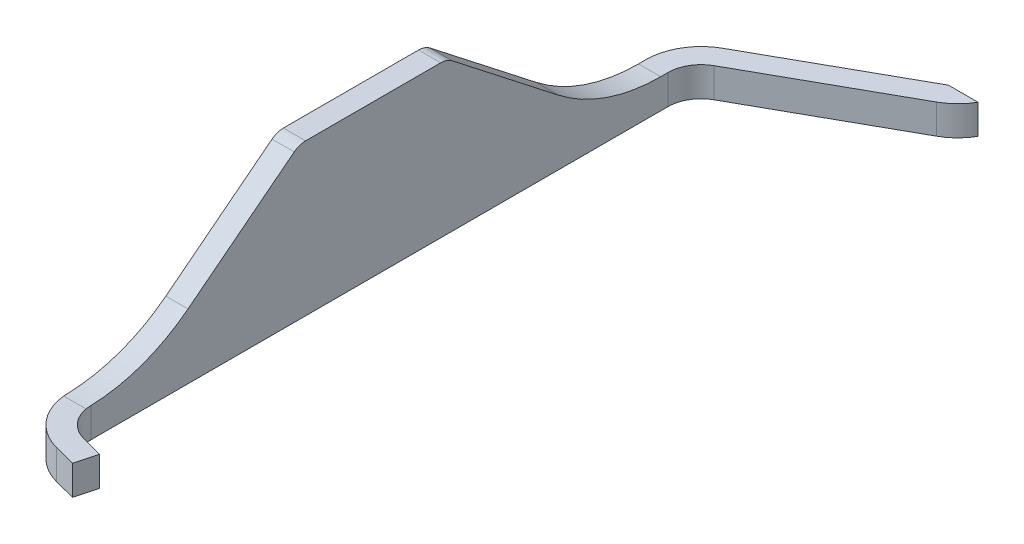
ISO-10303-21;
HEADER;
FILE_DESCRIPTION(('STEP AP214'),'2;1');
FILE_NAME('part.step','',(''),(''),'','','');
FILE_SCHEMA(('AUTOMOTIVE_DESIGN { 1 0 10303 214 1 1 1 1 }'));
ENDSEC;
DATA;
#1=APPLICATION_CONTEXT('core data for automotive mechanical design processes');
#2=APPLICATION_PROTOCOL_DEFINITION('international standard','automotive_design',2000,#1);
#3=PRODUCT_CONTEXT('',#1,'mechanical');
#4=PRODUCT('Part','Part','',(#3));
#5=PRODUCT_RELATED_PRODUCT_CATEGORY('part','',(#4));
#6=PRODUCT_DEFINITION_FORMATION('','',#4);
#7=PRODUCT_DEFINITION_CONTEXT('part definition',#1,'design');
#8=PRODUCT_DEFINITION('design','',#6,#7);
#9=PRODUCT_DEFINITION_SHAPE('','',#8);
#10=(LENGTH_UNIT() NAMED_UNIT(*) SI_UNIT(.MILLI.,.METRE.));
#11=(NAMED_UNIT(*) PLANE_ANGLE_UNIT() SI_UNIT($,.RADIAN.));
#12=(NAMED_UNIT(*) SI_UNIT($,.STERADIAN.) SOLID_ANGLE_UNIT());
#13=UNCERTAINTY_MEASURE_WITH_UNIT(LENGTH_MEASURE(1.E-05),#10,'distance_accuracy_value','');
#14=(GEOMETRIC_REPRESENTATION_CONTEXT(3) GLOBAL_UNCERTAINTY_ASSIGNED_CONTEXT((#13)) GLOBAL_UNIT_ASSIGNED_CONTEXT((#10,
#11,#12)) REPRESENTATION_CONTEXT('',''));
#15=CARTESIAN_POINT('',(0.,0.,0.));
#16=DIRECTION('',(0.,0.,1.));
#17=DIRECTION('',(1.,0.,0.));
#18=AXIS2_PLACEMENT_3D('',#15,#16,#17);
#19=CARTESIAN_POINT('',(-60.,41.,-79.7));
#20=DIRECTION('',(0.,1.,0.));
#21=DIRECTION('',(0.,0.,1.));
#22=AXIS2_PLACEMENT_3D('',#19,#20,#21);
#23=PLANE('',#22);
#24=DIRECTION('',(0.,0.,-1.));
#25=VECTOR('',#24,1.);
#26=CARTESIAN_POINT('',(-75.0000000000001,41.,76.3));
#27=LINE('',#26,#25);
#28=CARTESIAN_POINT('',(-75.0000000000001,41.,18.2797477350336));
#29=VERTEX_POINT('',#28);
#30=CARTESIAN_POINT('',(-75.0000000000001,40.9999999999988,-18.2797477350337));
#31=VERTEX_POINT('',#30);
#32=EDGE_CURVE('E356',#29,#31,#27,.T.);
#33=ORIENTED_EDGE('',*,*,#32,.F.);
#34=DIRECTION('',(-1.,0.,0.));
#35=VECTOR('',#34,1.);
#36=CARTESIAN_POINT('',(-20.1050949517347,41.,18.2797477350336));
#37=LINE('',#36,#35);
#38=CARTESIAN_POINT('',(-69.,41.,18.2797477350336));
#39=VERTEX_POINT('',#38);
#40=EDGE_CURVE('E227',#39,#29,#37,.T.);
#41=ORIENTED_EDGE('',*,*,#40,.F.);
#42=DIRECTION('',(0.,0.,1.));
#43=VECTOR('',#42,1.);
#44=CARTESIAN_POINT('',(-69.,41.,76.3));
#45=LINE('',#44,#43);
#46=CARTESIAN_POINT('',(-69.,41.,-18.2797477350337));
#47=VERTEX_POINT('',#46);
#48=EDGE_CURVE('E359',#47,#39,#45,.T.);
#49=ORIENTED_EDGE('',*,*,#48,.F.);
#50=DIRECTION('',(-1.,0.,0.));
#51=VECTOR('',#50,1.);
#52=CARTESIAN_POINT('',(-20.1050949517347,40.9999999999994,-18.2797477350336));
#53=LINE('',#52,#51);
#54=EDGE_CURVE('E220',#47,#31,#53,.T.);
#55=ORIENTED_EDGE('',*,*,#54,.T.);
#56=EDGE_LOOP('',(#33,#41,#49,#55));
#57=FACE_BOUND('',#56,.T.);
#58=ADVANCED_FACE('F35',(#57),#23,.T.);
#59=CARTESIAN_POINT('',(-20.1060949517347,41.,-114.7));
#60=DIRECTION('',(0.,0.,1.));
#61=DIRECTION('',(-1.,0.,0.));
#62=AXIS2_PLACEMENT_3D('',#59,#60,#61);
#63=PLANE('',#62);
#64=DIRECTION('',(0.,-1.,0.));
#65=VECTOR('',#64,1.);
#66=CARTESIAN_POINT('',(-20.1060949517347,41.,-114.7));
#67=LINE('',#66,#65);
#68=CARTESIAN_POINT('',(-20.1060949517347,8.00000000000119,-114.7));
#69=VERTEX_POINT('',#68);
#70=CARTESIAN_POINT('',(-20.1060949517347,0.,-114.7));
#71=VERTEX_POINT('',#70);
#72=EDGE_CURVE('E11',#69,#71,#67,.T.);
#73=ORIENTED_EDGE('',*,*,#72,.T.);
#74=DIRECTION('',(1.,0.,0.));
#75=VECTOR('',#74,1.);
#76=CARTESIAN_POINT('',(-20.1060949517347,0.,-114.7));
#77=LINE('',#76,#75);
#78=CARTESIAN_POINT('',(-28.1060949517348,0.,-114.7));
#79=VERTEX_POINT('',#78);
#80=EDGE_CURVE('E391',#79,#71,#77,.T.);
#81=ORIENTED_EDGE('',*,*,#80,.F.);
#82=DIRECTION('',(0.,-1.,0.));
#83=VECTOR('',#82,1.);
#84=CARTESIAN_POINT('',(-28.1060949517348,41.,-114.7));
#85=LINE('',#84,#83);
#86=CARTESIAN_POINT('',(-28.1060949517348,8.00000000000053,-114.7));
#87=VERTEX_POINT('',#86);
#88=EDGE_CURVE('E353',#87,#79,#85,.T.);
#89=ORIENTED_EDGE('',*,*,#88,.F.);
#90=DIRECTION('',(-1.,0.,0.));
#91=VECTOR('',#90,1.);
#92=CARTESIAN_POINT('',(-20.1050949517347,8.00000000000074,-114.7));
#93=LINE('',#92,#91);
#94=EDGE_CURVE('E193',#69,#87,#93,.T.);
#95=ORIENTED_EDGE('',*,*,#94,.F.);
#96=EDGE_LOOP('',(#73,#81,#89,#95));
#97=FACE_BOUND('',#96,.T.);
#98=ADVANCED_FACE('F37',(#97),#63,.F.);
#99=CARTESIAN_POINT('',(-33.0782482086875,41.,-122.231483245558));
#100=DIRECTION('',(0.,-1.,0.));
#101=DIRECTION('',(0.,0.,-1.));
#102=AXIS2_PLACEMENT_3D('',#99,#100,#101);
#103=CYLINDRICAL_SURFACE('',#102,15.);
#104=DIRECTION('',(0.,-1.,0.));
#105=VECTOR('',#104,1.);
#106=CARTESIAN_POINT('',(-25.7625331487724,41.,-109.136434060384));
#107=LINE('',#106,#105);
#108=CARTESIAN_POINT('',(-25.7625331487724,8.00000000000042,-109.136434060384));
#109=VERTEX_POINT('',#108);
#110=CARTESIAN_POINT('',(-25.7625331487724,0.,-109.136434060384));
#111=VERTEX_POINT('',#110);
#112=EDGE_CURVE('E43',#109,#111,#107,.T.);
#113=ORIENTED_EDGE('',*,*,#112,.T.);
#114=CARTESIAN_POINT('',(-33.0782482086875,0.,-122.231483245558));
#115=DIRECTION('',(0.,-1.,0.));
#116=DIRECTION('',(0.,0.,-1.));
#117=AXIS2_PLACEMENT_3D('',#114,#115,#116);
#118=CIRCLE('',#117,15.);
#119=EDGE_CURVE('E320',#71,#111,#118,.T.);
#120=ORIENTED_EDGE('',*,*,#119,.F.);
#121=ORIENTED_EDGE('',*,*,#72,.F.);
#122=CARTESIAN_POINT('',(-33.0782482086875,8.0000000000009,-122.231483245558));
#123=DIRECTION('',(0.,1.,0.));
#124=DIRECTION('',(0.,0.,-1.));
#125=AXIS2_PLACEMENT_3D('',#122,#123,#124);
#126=CIRCLE('',#125,15.);
#127=EDGE_CURVE('E226',#69,#109,#126,.F.);
#128=ORIENTED_EDGE('',*,*,#127,.T.);
#129=EDGE_LOOP('',(#113,#120,#121,#128));
#130=FACE_BOUND('',#129,.T.);
#131=ADVANCED_FACE('F307',(#130),#103,.T.);
#132=CARTESIAN_POINT('',(-64.3894290359491,41.,-87.5570295111045));
#133=DIRECTION('',(-0.487714337327672,0.,-0.873003279011614));
#134=DIRECTION('',(0.873003279011614,0.,-0.487714337327672));
#135=AXIS2_PLACEMENT_3D('',#132,#133,#134);
#136=PLANE('',#135);
#137=DIRECTION('',(0.,-1.,0.));
#138=VECTOR('',#137,1.);
#139=CARTESIAN_POINT('',(-64.3894290359491,41.,-87.5570295111045));
#140=LINE('',#139,#138);
#141=CARTESIAN_POINT('',(-64.3894290359491,8.00000000000023,-87.5570295111045));
#142=VERTEX_POINT('',#141);
#143=CARTESIAN_POINT('',(-64.3894290359491,0.,-87.5570295111045));
#144=VERTEX_POINT('',#143);
#145=EDGE_CURVE('E323',#142,#144,#140,.T.);
#146=ORIENTED_EDGE('',*,*,#145,.T.);
#147=DIRECTION('',(-0.873003279011614,0.,0.487714337327672));
#148=VECTOR('',#147,1.);
#149=CARTESIAN_POINT('',(-64.3894290359491,0.,-87.5570295111045));
#150=LINE('',#149,#148);
#151=EDGE_CURVE('E387',#111,#144,#150,.T.);
#152=ORIENTED_EDGE('',*,*,#151,.F.);
#153=ORIENTED_EDGE('',*,*,#112,.F.);
#154=DIRECTION('',(-0.873003279011614,0.,0.487714337327672));
#155=VECTOR('',#154,1.);
#156=CARTESIAN_POINT('',(-19.0819689917233,8.00000000000071,-112.86861582781));
#157=LINE('',#156,#155);
#158=EDGE_CURVE('E439',#109,#142,#157,.T.);
#159=ORIENTED_EDGE('',*,*,#158,.T.);
#160=EDGE_LOOP('',(#146,#152,#153,#159));
#161=FACE_BOUND('',#160,.T.);
#162=ADVANCED_FACE('F304',(#161),#136,.F.);
#163=CARTESIAN_POINT('',(-60.,41.,-79.7));
#164=DIRECTION('',(0.,-1.,0.));
#165=DIRECTION('',(0.,0.,-1.));
#166=AXIS2_PLACEMENT_3D('',#163,#164,#165);
#167=CYLINDRICAL_SURFACE('',#166,9.00000000000002);
#168=DIRECTION('',(0.,-1.,0.));
#169=VECTOR('',#168,1.);
#170=CARTESIAN_POINT('',(-69.,41.,-79.7));
#171=LINE('',#170,#169);
#172=CARTESIAN_POINT('',(-69.,8.00000000000003,-79.7));
#173=VERTEX_POINT('',#172);
#174=CARTESIAN_POINT('',(-69.,0.,-79.7));
#175=VERTEX_POINT('',#174);
#176=EDGE_CURVE('E325',#173,#175,#171,.T.);
#177=ORIENTED_EDGE('',*,*,#176,.T.);
#178=CARTESIAN_POINT('',(-60.,0.,-79.7));
#179=DIRECTION('',(0.,1.,0.));
#180=DIRECTION('',(0.,0.,1.));
#181=AXIS2_PLACEMENT_3D('',#178,#179,#180);
#182=CIRCLE('',#181,9.00000000000002);
#183=EDGE_CURVE('E384',#144,#175,#182,.T.);
#184=ORIENTED_EDGE('',*,*,#183,.F.);
#185=ORIENTED_EDGE('',*,*,#145,.F.);
#186=CARTESIAN_POINT('',(-60.,8.00000000000005,-79.7));
#187=DIRECTION('',(0.,1.,0.));
#188=DIRECTION('',(0.,0.,-1.));
#189=AXIS2_PLACEMENT_3D('',#186,#187,#188);
#190=CIRCLE('',#189,9.00000000000002);
#191=EDGE_CURVE('E223',#142,#173,#190,.T.);
#192=ORIENTED_EDGE('',*,*,#191,.T.);
#193=EDGE_LOOP('',(#177,#184,#185,#192));
#194=FACE_BOUND('',#193,.T.);
#195=ADVANCED_FACE('F301',(#194),#167,.F.);
#196=CARTESIAN_POINT('',(-69.,41.,76.3));
#197=DIRECTION('',(-1.,0.,0.));
#198=DIRECTION('',(0.,0.,-1.));
#199=AXIS2_PLACEMENT_3D('',#196,#197,#198);
#200=PLANE('',#199);
#201=CARTESIAN_POINT('',(-69.,53.,-77.7635203846935));
#202=DIRECTION('',(1.,0.,0.));
#203=DIRECTION('',(0.,0.,-1.));
#204=AXIS2_PLACEMENT_3D('',#201,#202,#203);
#205=CIRCLE('',#204,45.);
#206=CARTESIAN_POINT('',(-69.,8.00000000000001,-77.7635203846937));
#207=VERTEX_POINT('',#206);
#208=CARTESIAN_POINT('',(-69.,17.5257897431719,-50.0763318915591));
#209=VERTEX_POINT('',#208);
#210=EDGE_CURVE('E189',#207,#209,#205,.F.);
#211=ORIENTED_EDGE('',*,*,#210,.T.);
#212=DIRECTION('',(0.,0.615270855402983,0.788315783485071));
#213=VECTOR('',#212,1.);
#214=CARTESIAN_POINT('',(-69.,39.9415789174242,-21.3561020120485));
#215=LINE('',#214,#213);
#216=CARTESIAN_POINT('',(-69.,39.9415789174242,-21.3561020120485));
#217=VERTEX_POINT('',#216);
#218=EDGE_CURVE('E217',#209,#217,#215,.T.);
#219=ORIENTED_EDGE('',*,*,#218,.T.);
#220=CARTESIAN_POINT('',(-69.,35.9999999999988,-18.2797477350336));
#221=DIRECTION('',(1.,0.,0.));
#222=DIRECTION('',(0.,0.,-1.));
#223=AXIS2_PLACEMENT_3D('',#220,#221,#222);
#224=CIRCLE('',#223,5.);
#225=EDGE_CURVE('E50',#217,#47,#224,.T.);
#226=ORIENTED_EDGE('',*,*,#225,.T.);
#227=ORIENTED_EDGE('',*,*,#48,.T.);
#228=CARTESIAN_POINT('',(-69.,36.,18.2797477350336));
#229=DIRECTION('',(1.,0.,0.));
#230=DIRECTION('',(0.,0.,-1.));
#231=AXIS2_PLACEMENT_3D('',#228,#229,#230);
#232=CIRCLE('',#231,5.);
#233=CARTESIAN_POINT('',(-69.,39.9415789174253,21.3561020120485));
#234=VERTEX_POINT('',#233);
#235=EDGE_CURVE('E422',#39,#234,#232,.T.);
#236=ORIENTED_EDGE('',*,*,#235,.T.);
#237=DIRECTION('',(0.,-0.615270855402983,0.788315783485071));
#238=VECTOR('',#237,1.);
#239=CARTESIAN_POINT('',(-69.,39.9415789174253,21.3561020120485));
#240=LINE('',#239,#238);
#241=CARTESIAN_POINT('',(-69.,17.5257897431719,50.0763318915607));
#242=VERTEX_POINT('',#241);
#243=EDGE_CURVE('E424',#234,#242,#240,.T.);
#244=ORIENTED_EDGE('',*,*,#243,.T.);
#245=CARTESIAN_POINT('',(-69.,53.,77.763520384695));
#246=DIRECTION('',(1.,0.,0.));
#247=DIRECTION('',(0.,0.,-1.));
#248=AXIS2_PLACEMENT_3D('',#245,#246,#247);
#249=CIRCLE('',#248,45.);
#250=CARTESIAN_POINT('',(-69.,8.02380509554436,76.3));
#251=VERTEX_POINT('',#250);
#252=EDGE_CURVE('E393',#242,#251,#249,.F.);
#253=ORIENTED_EDGE('',*,*,#252,.T.);
#254=DIRECTION('',(0.,-1.,0.));
#255=VECTOR('',#254,1.);
#256=CARTESIAN_POINT('',(-69.,41.,76.3));
#257=LINE('',#256,#255);
#258=CARTESIAN_POINT('',(-69.,0.,76.3));
#259=VERTEX_POINT('',#258);
#260=EDGE_CURVE('E330',#251,#259,#257,.T.);
#261=ORIENTED_EDGE('',*,*,#260,.T.);
#262=DIRECTION('',(0.,0.,1.));
#263=VECTOR('',#262,1.);
#264=CARTESIAN_POINT('',(-69.,0.,76.3));
#265=LINE('',#264,#263);
#266=EDGE_CURVE('E381',#175,#259,#265,.T.);
#267=ORIENTED_EDGE('',*,*,#266,.F.);
#268=ORIENTED_EDGE('',*,*,#176,.F.);
#269=DIRECTION('',(0.,0.,1.));
#270=VECTOR('',#269,1.);
#271=CARTESIAN_POINT('',(-69.,8.00000000000074,-114.7));
#272=LINE('',#271,#270);
#273=EDGE_CURVE('E209',#173,#207,#272,.T.);
#274=ORIENTED_EDGE('',*,*,#273,.T.);
#275=EDGE_LOOP('',(#211,#219,#226,#227,#236,#244,#253,#261,#267,#268,#274));
#276=FACE_BOUND('',#275,.T.);
#277=ADVANCED_FACE('F297',(#276),#200,.F.);
#278=CARTESIAN_POINT('',(-60.,41.,76.3));
#279=DIRECTION('',(0.,-1.,0.));
#280=DIRECTION('',(0.,0.,-1.));
#281=AXIS2_PLACEMENT_3D('',#278,#279,#280);
#282=CYLINDRICAL_SURFACE('',#281,9.00000000000001);
#283=DIRECTION('',(0.,-1.,0.));
#284=VECTOR('',#283,1.);
#285=CARTESIAN_POINT('',(-62.2692463644368,41.,85.0092204552125));
#286=LINE('',#285,#284);
#287=CARTESIAN_POINT('',(-62.2692463644368,8.,85.0092204552125));
#288=VERTEX_POINT('',#287);
#289=CARTESIAN_POINT('',(-62.2692463644368,0.,85.0092204552125));
#290=VERTEX_POINT('',#289);
#291=EDGE_CURVE('E333',#288,#290,#286,.T.);
#292=ORIENTED_EDGE('',*,*,#291,.T.);
#293=CARTESIAN_POINT('',(-60.,0.,76.3));
#294=DIRECTION('',(0.,1.,0.));
#295=DIRECTION('',(0.,0.,1.));
#296=AXIS2_PLACEMENT_3D('',#293,#294,#295);
#297=CIRCLE('',#296,9.00000000000001);
#298=EDGE_CURVE('E378',#259,#290,#297,.T.);
#299=ORIENTED_EDGE('',*,*,#298,.F.);
#300=ORIENTED_EDGE('',*,*,#260,.F.);
#301=CARTESIAN_POINT('',(-69.,8.02380509554436,76.3));
#302=CARTESIAN_POINT('',(-68.9999719529658,8.01584383382791,76.5454869876502));
#303=CARTESIAN_POINT('',(-68.9899753282851,8.00987944500765,76.7901905135326));
#304=CARTESIAN_POINT('',(-68.9500449236305,8.0019444131595,77.2780306417643));
#305=CARTESIAN_POINT('',(-68.9201111436563,7.99997377013163,77.5211672441136));
#306=CARTESIAN_POINT('',(-68.8802087860355,8.00000000000001,77.7635203846952));
#307=B_SPLINE_CURVE_WITH_KNOTS('',3,(#301,#302,#303,#304,#305,#306),.UNSPECIFIED.,.F.,.F.,(4,2,
4),(0.,0.734940744662144,1.46988148933146),.UNSPECIFIED.);
#308=CARTESIAN_POINT('',(-68.8802087860355,8.00000000000001,77.7635203846952));
#309=VERTEX_POINT('',#308);
#310=EDGE_CURVE('E240',#251,#309,#307,.T.);
#311=ORIENTED_EDGE('',*,*,#310,.T.);
#312=CARTESIAN_POINT('',(-60.,8.00000000000001,76.3));
#313=DIRECTION('',(0.,1.,0.));
#314=DIRECTION('',(0.,0.,-1.));
#315=AXIS2_PLACEMENT_3D('',#312,#313,#314);
#316=CIRCLE('',#315,9.00000000000001);
#317=EDGE_CURVE('E398',#309,#288,#316,.T.);
#318=ORIENTED_EDGE('',*,*,#317,.T.);
#319=EDGE_LOOP('',(#292,#299,#300,#311,#318));
#320=FACE_BOUND('',#319,.T.);
#321=ADVANCED_FACE('F293',(#320),#282,.F.);
#322=CARTESIAN_POINT('',(-56.4630993942952,41.,86.522051364837));
#323=DIRECTION('',(-0.25213848493742,0.,0.967691161690269));
#324=DIRECTION('',(-0.967691161690269,0.,-0.25213848493742));
#325=AXIS2_PLACEMENT_3D('',#322,#323,#324);
#326=PLANE('',#325);
#327=DIRECTION('',(0.,-1.,0.));
#328=VECTOR('',#327,1.);
#329=CARTESIAN_POINT('',(-56.4630993942952,41.,86.522051364837));
#330=LINE('',#329,#328);
#331=CARTESIAN_POINT('',(-56.4630993942952,8.,86.522051364837));
#332=VERTEX_POINT('',#331);
#333=CARTESIAN_POINT('',(-56.4630993942952,0.,86.522051364837));
#334=VERTEX_POINT('',#333);
#335=EDGE_CURVE('E336',#332,#334,#330,.T.);
#336=ORIENTED_EDGE('',*,*,#335,.T.);
#337=DIRECTION('',(0.967691161690269,0.,0.25213848493742));
#338=VECTOR('',#337,1.);
#339=CARTESIAN_POINT('',(-56.4630993942952,0.,86.522051364837));
#340=LINE('',#339,#338);
#341=EDGE_CURVE('E375',#290,#334,#340,.T.);
#342=ORIENTED_EDGE('',*,*,#341,.F.);
#343=ORIENTED_EDGE('',*,*,#291,.F.);
#344=DIRECTION('',(0.967691161690269,0.,0.25213848493742));
#345=VECTOR('',#344,1.);
#346=CARTESIAN_POINT('',(-20.9998575448981,8.,95.7622391694439));
#347=LINE('',#346,#345);
#348=EDGE_CURVE('E401',#288,#332,#347,.T.);
#349=ORIENTED_EDGE('',*,*,#348,.T.);
#350=EDGE_LOOP('',(#336,#342,#343,#349));
#351=FACE_BOUND('',#350,.T.);
#352=ADVANCED_FACE('F289',(#351),#326,.F.);
#353=CARTESIAN_POINT('',(-57.9759303039197,41.,92.3281983349786));
#354=DIRECTION('',(-0.96769116169027,0.,-0.252138484937418));
#355=DIRECTION('',(0.252138484937418,0.,-0.96769116169027));
#356=AXIS2_PLACEMENT_3D('',#353,#354,#355);
#357=PLANE('',#356);
#358=DIRECTION('',(0.,-1.,0.));
#359=VECTOR('',#358,1.);
#360=CARTESIAN_POINT('',(-57.9759303039197,41.,92.3281983349786));
#361=LINE('',#360,#359);
#362=CARTESIAN_POINT('',(-57.9759303039197,8.,92.3281983349786));
#363=VERTEX_POINT('',#362);
#364=CARTESIAN_POINT('',(-57.9759303039197,0.,92.3281983349786));
#365=VERTEX_POINT('',#364);
#366=EDGE_CURVE('E339',#363,#365,#361,.T.);
#367=ORIENTED_EDGE('',*,*,#366,.T.);
#368=DIRECTION('',(-0.252138484937418,0.,0.96769116169027));
#369=VECTOR('',#368,1.);
#370=CARTESIAN_POINT('',(-57.9759303039197,0.,92.3281983349786));
#371=LINE('',#370,#369);
#372=EDGE_CURVE('E372',#334,#365,#371,.T.);
#373=ORIENTED_EDGE('',*,*,#372,.F.);
#374=ORIENTED_EDGE('',*,*,#335,.F.);
#375=DIRECTION('',(-0.252138484937418,0.,0.967691161690269));
#376=VECTOR('',#375,1.);
#377=CARTESIAN_POINT('',(-55.5683368011318,8.,83.0880105303718));
#378=LINE('',#377,#376);
#379=EDGE_CURVE('E404',#332,#363,#378,.T.);
#380=ORIENTED_EDGE('',*,*,#379,.T.);
#381=EDGE_LOOP('',(#367,#373,#374,#380));
#382=FACE_BOUND('',#381,.T.);
#383=ADVANCED_FACE('F285',(#382),#357,.F.);
#384=CARTESIAN_POINT('',(-57.9759303039197,41.,92.3281983349786));
#385=DIRECTION('',(0.25213848493742,0.,-0.967691161690269));
#386=DIRECTION('',(0.967691161690269,0.,0.25213848493742));
#387=AXIS2_PLACEMENT_3D('',#384,#385,#386);
#388=PLANE('',#387);
#389=DIRECTION('',(0.,-1.,0.));
#390=VECTOR('',#389,1.);
#391=CARTESIAN_POINT('',(-63.7820772740613,41.,90.8153674253541));
#392=LINE('',#391,#390);
#393=CARTESIAN_POINT('',(-63.7820772740613,8.00000000000001,90.8153674253541));
#394=VERTEX_POINT('',#393);
#395=CARTESIAN_POINT('',(-63.7820772740613,0.,90.8153674253541));
#396=VERTEX_POINT('',#395);
#397=EDGE_CURVE('E342',#394,#396,#392,.T.);
#398=ORIENTED_EDGE('',*,*,#397,.T.);
#399=DIRECTION('',(-0.967691161690269,0.,-0.25213848493742));
#400=VECTOR('',#399,1.);
#401=CARTESIAN_POINT('',(-57.9759303039197,0.,92.3281983349786));
#402=LINE('',#401,#400);
#403=EDGE_CURVE('E369',#365,#396,#402,.T.);
#404=ORIENTED_EDGE('',*,*,#403,.F.);
#405=ORIENTED_EDGE('',*,*,#366,.F.);
#406=DIRECTION('',(-0.967691161690269,0.,-0.25213848493742));
#407=VECTOR('',#406,1.);
#408=CARTESIAN_POINT('',(-22.5126884545226,8.,101.568386139585));
#409=LINE('',#408,#407);
#410=EDGE_CURVE('E407',#363,#394,#409,.T.);
#411=ORIENTED_EDGE('',*,*,#410,.T.);
#412=EDGE_LOOP('',(#398,#404,#405,#411));
#413=FACE_BOUND('',#412,.T.);
#414=ADVANCED_FACE('F281',(#413),#388,.F.);
#415=CARTESIAN_POINT('',(-60.,41.,76.3));
#416=DIRECTION('',(0.,-1.,0.));
#417=DIRECTION('',(0.,0.,-1.));
#418=AXIS2_PLACEMENT_3D('',#415,#416,#417);
#419=CYLINDRICAL_SURFACE('',#418,15.);
#420=CARTESIAN_POINT('',(-74.9284328743369,8.00000000000001,77.7635203846952));
#421=CARTESIAN_POINT('',(-74.9522846160473,7.99999078629254,77.5201187225977));
#422=CARTESIAN_POINT('',(-74.9701744140411,8.00196993740084,77.2764578594911));
#423=CARTESIAN_POINT('',(-74.9940301225955,8.00990496924896,76.7886177312594));
#424=CARTESIAN_POINT('',(-74.9999960331561,8.01586084998878,76.5444384661343));
#425=CARTESIAN_POINT('',(-75.,8.02380509554436,76.3));
#426=B_SPLINE_CURVE_WITH_KNOTS('',3,(#420,#421,#422,#423,#424,#425),.UNSPECIFIED.,.F.,.F.,(4,2,
4),(0.,0.732974217207773,1.46594843441522),.UNSPECIFIED.);
#427=CARTESIAN_POINT('',(-74.9284328743369,8.00000000000001,77.7635203846952));
#428=VERTEX_POINT('',#427);
#429=CARTESIAN_POINT('',(-75.0000000000001,8.02380509554436,76.3));
#430=VERTEX_POINT('',#429);
#431=EDGE_CURVE('E232',#428,#430,#426,.T.);
#432=ORIENTED_EDGE('',*,*,#431,.T.);
#433=DIRECTION('',(0.,-1.,0.));
#434=VECTOR('',#433,1.);
#435=CARTESIAN_POINT('',(-75.0000000000001,41.,76.3));
#436=LINE('',#435,#434);
#437=CARTESIAN_POINT('',(-75.0000000000001,0.,76.3));
#438=VERTEX_POINT('',#437);
#439=EDGE_CURVE('E345',#430,#438,#436,.T.);
#440=ORIENTED_EDGE('',*,*,#439,.T.);
#441=CARTESIAN_POINT('',(-60.,0.,76.3));
#442=DIRECTION('',(0.,-1.,0.));
#443=DIRECTION('',(0.,0.,1.));
#444=AXIS2_PLACEMENT_3D('',#441,#442,#443);
#445=CIRCLE('',#444,15.);
#446=EDGE_CURVE('E366',#396,#438,#445,.T.);
#447=ORIENTED_EDGE('',*,*,#446,.F.);
#448=ORIENTED_EDGE('',*,*,#397,.F.);
#449=CARTESIAN_POINT('',(-60.,8.00000000000001,76.3));
#450=DIRECTION('',(0.,1.,0.));
#451=DIRECTION('',(0.,0.,-1.));
#452=AXIS2_PLACEMENT_3D('',#449,#450,#451);
#453=CIRCLE('',#452,15.);
#454=EDGE_CURVE('E229',#394,#428,#453,.F.);
#455=ORIENTED_EDGE('',*,*,#454,.T.);
#456=EDGE_LOOP('',(#432,#440,#447,#448,#455));
#457=FACE_BOUND('',#456,.T.);
#458=ADVANCED_FACE('F278',(#457),#419,.T.);
#459=CARTESIAN_POINT('',(-75.0000000000001,41.,76.3));
#460=DIRECTION('',(1.,0.,0.));
#461=DIRECTION('',(0.,0.,1.));
#462=AXIS2_PLACEMENT_3D('',#459,#460,#461);
#463=PLANE('',#462);
#464=DIRECTION('',(0.,-1.,0.));
#465=VECTOR('',#464,1.);
#466=CARTESIAN_POINT('',(-75.0000000000001,41.,-79.7));
#467=LINE('',#466,#465);
#468=CARTESIAN_POINT('',(-75.0000000000001,8.00000000000037,-79.7));
#469=VERTEX_POINT('',#468);
#470=CARTESIAN_POINT('',(-75.0000000000001,0.,-79.7));
#471=VERTEX_POINT('',#470);
#472=EDGE_CURVE('E348',#469,#471,#467,.T.);
#473=ORIENTED_EDGE('',*,*,#472,.T.);
#474=DIRECTION('',(0.,0.,-1.));
#475=VECTOR('',#474,1.);
#476=CARTESIAN_POINT('',(-75.0000000000001,0.,76.3));
#477=LINE('',#476,#475);
#478=EDGE_CURVE('E363',#438,#471,#477,.T.);
#479=ORIENTED_EDGE('',*,*,#478,.F.);
#480=ORIENTED_EDGE('',*,*,#439,.F.);
#481=CARTESIAN_POINT('',(-75.,53.,77.763520384695));
#482=DIRECTION('',(1.,0.,0.));
#483=DIRECTION('',(0.,0.,-1.));
#484=AXIS2_PLACEMENT_3D('',#481,#482,#483);
#485=CIRCLE('',#484,45.);
#486=CARTESIAN_POINT('',(-75.,17.5257897431719,50.0763318915607));
#487=VERTEX_POINT('',#486);
#488=EDGE_CURVE('E419',#430,#487,#485,.T.);
#489=ORIENTED_EDGE('',*,*,#488,.T.);
#490=DIRECTION('',(0.,0.615270855402983,-0.788315783485071));
#491=VECTOR('',#490,1.);
#492=CARTESIAN_POINT('',(-75.0000000000001,39.9415789174253,21.3561020120485));
#493=LINE('',#492,#491);
#494=CARTESIAN_POINT('',(-75.0000000000001,39.9415789174253,21.3561020120485));
#495=VERTEX_POINT('',#494);
#496=EDGE_CURVE('E417',#487,#495,#493,.T.);
#497=ORIENTED_EDGE('',*,*,#496,.T.);
#498=CARTESIAN_POINT('',(-75.0000000000001,36.,18.2797477350336));
#499=DIRECTION('',(-1.,0.,0.));
#500=DIRECTION('',(0.,0.,1.));
#501=AXIS2_PLACEMENT_3D('',#498,#499,#500);
#502=CIRCLE('',#501,5.);
#503=EDGE_CURVE('E58',#495,#29,#502,.T.);
#504=ORIENTED_EDGE('',*,*,#503,.T.);
#505=ORIENTED_EDGE('',*,*,#32,.T.);
#506=CARTESIAN_POINT('',(-75.0000000000001,35.9999999999988,-18.2797477350336));
#507=DIRECTION('',(-1.,0.,0.));
#508=DIRECTION('',(0.,0.,-1.));
#509=AXIS2_PLACEMENT_3D('',#506,#507,#508);
#510=CIRCLE('',#509,5.);
#511=CARTESIAN_POINT('',(-75.0000000000001,39.9415789174242,-21.3561020120485));
#512=VERTEX_POINT('',#511);
#513=EDGE_CURVE('E202',#31,#512,#510,.T.);
#514=ORIENTED_EDGE('',*,*,#513,.T.);
#515=DIRECTION('',(0.,-0.615270855402983,-0.788315783485071));
#516=VECTOR('',#515,1.);
#517=CARTESIAN_POINT('',(-75.0000000000001,39.9415789174242,-21.3561020120485));
#518=LINE('',#517,#516);
#519=CARTESIAN_POINT('',(-75.0000000000001,17.5257897431719,-50.0763318915591));
#520=VERTEX_POINT('',#519);
#521=EDGE_CURVE('E208',#512,#520,#518,.T.);
#522=ORIENTED_EDGE('',*,*,#521,.T.);
#523=CARTESIAN_POINT('',(-75.0000000000001,53.,-77.7635203846935));
#524=DIRECTION('',(1.,0.,0.));
#525=DIRECTION('',(0.,0.,-1.));
#526=AXIS2_PLACEMENT_3D('',#523,#524,#525);
#527=CIRCLE('',#526,45.);
#528=CARTESIAN_POINT('',(-75.0000000000001,8.00000000000001,-77.7635203846937));
#529=VERTEX_POINT('',#528);
#530=EDGE_CURVE('E186',#520,#529,#527,.T.);
#531=ORIENTED_EDGE('',*,*,#530,.T.);
#532=DIRECTION('',(0.,0.,-1.));
#533=VECTOR('',#532,1.);
#534=CARTESIAN_POINT('',(-75.0000000000001,8.00000000000074,-114.7));
#535=LINE('',#534,#533);
#536=EDGE_CURVE('E196',#529,#469,#535,.T.);
#537=ORIENTED_EDGE('',*,*,#536,.T.);
#538=EDGE_LOOP('',(#473,#479,#480,#489,#497,#504,#505,#514,#522,#531,#537));
#539=FACE_BOUND('',#538,.T.);
#540=ADVANCED_FACE('F205',(#539),#463,.F.);
#541=CARTESIAN_POINT('',(-60.,41.,-79.7));
#542=DIRECTION('',(0.,-1.,0.));
#543=DIRECTION('',(0.,0.,-1.));
#544=AXIS2_PLACEMENT_3D('',#541,#542,#543);
#545=CYLINDRICAL_SURFACE('',#544,15.);
#546=DIRECTION('',(0.,-1.,0.));
#547=VECTOR('',#546,1.);
#548=CARTESIAN_POINT('',(-67.3157150599151,41.,-92.7950491851742));
#549=LINE('',#548,#547);
#550=CARTESIAN_POINT('',(-67.3157150599151,8.00000000000053,-92.7950491851742));
#551=VERTEX_POINT('',#550);
#552=CARTESIAN_POINT('',(-67.3157150599151,0.,-92.7950491851742));
#553=VERTEX_POINT('',#552);
#554=EDGE_CURVE('E350',#551,#553,#549,.T.);
#555=ORIENTED_EDGE('',*,*,#554,.T.);
#556=CARTESIAN_POINT('',(-60.,0.,-79.7));
#557=DIRECTION('',(0.,-1.,0.));
#558=DIRECTION('',(0.,0.,1.));
#559=AXIS2_PLACEMENT_3D('',#556,#557,#558);
#560=CIRCLE('',#559,15.);
#561=EDGE_CURVE('E360',#471,#553,#560,.T.);
#562=ORIENTED_EDGE('',*,*,#561,.F.);
#563=ORIENTED_EDGE('',*,*,#472,.F.);
#564=CARTESIAN_POINT('',(-60.,8.00000000000005,-79.7));
#565=DIRECTION('',(0.,1.,0.));
#566=DIRECTION('',(0.,0.,-1.));
#567=AXIS2_PLACEMENT_3D('',#564,#565,#566);
#568=CIRCLE('',#567,15.);
#569=EDGE_CURVE('E199',#469,#551,#568,.F.);
#570=ORIENTED_EDGE('',*,*,#569,.T.);
#571=EDGE_LOOP('',(#555,#562,#563,#570));
#572=FACE_BOUND('',#571,.T.);
#573=ADVANCED_FACE('F271',(#572),#545,.T.);
#574=CARTESIAN_POINT('',(-67.3157150599151,41.,-92.7950491851742));
#575=DIRECTION('',(0.487714337327672,0.,0.873003279011614));
#576=DIRECTION('',(-0.873003279011614,0.,0.487714337327672));
#577=AXIS2_PLACEMENT_3D('',#574,#575,#576);
#578=PLANE('',#577);
#579=ORIENTED_EDGE('',*,*,#88,.T.);
#580=DIRECTION('',(0.873003279011614,0.,-0.487714337327672));
#581=VECTOR('',#580,1.);
#582=CARTESIAN_POINT('',(-67.3157150599151,0.,-92.7950491851742));
#583=LINE('',#582,#581);
#584=EDGE_CURVE('E357',#553,#79,#583,.T.);
#585=ORIENTED_EDGE('',*,*,#584,.F.);
#586=ORIENTED_EDGE('',*,*,#554,.F.);
#587=DIRECTION('',(0.873003279011614,0.,-0.487714337327672));
#588=VECTOR('',#587,1.);
#589=CARTESIAN_POINT('',(-22.0082550156893,8.00000000000081,-118.10663550188));
#590=LINE('',#589,#588);
#591=EDGE_CURVE('E222',#551,#87,#590,.T.);
#592=ORIENTED_EDGE('',*,*,#591,.T.);
#593=EDGE_LOOP('',(#579,#585,#586,#592));
#594=FACE_BOUND('',#593,.T.);
#595=ADVANCED_FACE('F267',(#594),#578,.F.);
#596=CARTESIAN_POINT('',(-60.,0.,-79.7));
#597=DIRECTION('',(0.,1.,0.));
#598=DIRECTION('',(0.,0.,1.));
#599=AXIS2_PLACEMENT_3D('',#596,#597,#598);
#600=PLANE('',#599);
#601=ORIENTED_EDGE('',*,*,#80,.T.);
#602=ORIENTED_EDGE('',*,*,#119,.T.);
#603=ORIENTED_EDGE('',*,*,#151,.T.);
#604=ORIENTED_EDGE('',*,*,#183,.T.);
#605=ORIENTED_EDGE('',*,*,#266,.T.);
#606=ORIENTED_EDGE('',*,*,#298,.T.);
#607=ORIENTED_EDGE('',*,*,#341,.T.);
#608=ORIENTED_EDGE('',*,*,#372,.T.);
#609=ORIENTED_EDGE('',*,*,#403,.T.);
#610=ORIENTED_EDGE('',*,*,#446,.T.);
#611=ORIENTED_EDGE('',*,*,#478,.T.);
#612=ORIENTED_EDGE('',*,*,#561,.T.);
#613=ORIENTED_EDGE('',*,*,#584,.T.);
#614=EDGE_LOOP('',(#601,#602,#603,#604,#605,#606,#607,#608,#609,#610,#611,#612,#613));
#615=FACE_BOUND('',#614,.T.);
#616=ADVANCED_FACE('F260',(#615),#600,.F.);
#617=CARTESIAN_POINT('',(-20.1050949517347,8.,92.3281983349786));
#618=DIRECTION('',(0.,-1.,0.));
#619=DIRECTION('',(0.,0.,-1.));
#620=AXIS2_PLACEMENT_3D('',#617,#618,#619);
#621=PLANE('',#620);
#622=ORIENTED_EDGE('',*,*,#317,.F.);
#623=DIRECTION('',(-1.,0.,0.));
#624=VECTOR('',#623,1.);
#625=CARTESIAN_POINT('',(-20.1050949517347,8.00000000000001,77.7635203846952));
#626=LINE('',#625,#624);
#627=EDGE_CURVE('E411',#309,#428,#626,.T.);
#628=ORIENTED_EDGE('',*,*,#627,.T.);
#629=ORIENTED_EDGE('',*,*,#454,.F.);
#630=ORIENTED_EDGE('',*,*,#410,.F.);
#631=ORIENTED_EDGE('',*,*,#379,.F.);
#632=ORIENTED_EDGE('',*,*,#348,.F.);
#633=EDGE_LOOP('',(#622,#628,#629,#630,#631,#632));
#634=FACE_BOUND('',#633,.T.);
#635=ADVANCED_FACE('F254',(#634),#621,.F.);
#636=CARTESIAN_POINT('',(-20.1050949517347,53.,77.763520384695));
#637=DIRECTION('',(-1.,0.,0.));
#638=DIRECTION('',(0.,0.,-1.));
#639=AXIS2_PLACEMENT_3D('',#636,#637,#638);
#640=CYLINDRICAL_SURFACE('',#639,45.);
#641=ORIENTED_EDGE('',*,*,#252,.F.);
#642=DIRECTION('',(-1.,0.,0.));
#643=VECTOR('',#642,1.);
#644=CARTESIAN_POINT('',(-20.1050949517347,17.5257897431719,50.0763318915607));
#645=LINE('',#644,#643);
#646=EDGE_CURVE('E413',#242,#487,#645,.T.);
#647=ORIENTED_EDGE('',*,*,#646,.T.);
#648=ORIENTED_EDGE('',*,*,#488,.F.);
#649=ORIENTED_EDGE('',*,*,#431,.F.);
#650=ORIENTED_EDGE('',*,*,#627,.F.);
#651=ORIENTED_EDGE('',*,*,#310,.F.);
#652=EDGE_LOOP('',(#641,#647,#648,#649,#650,#651));
#653=FACE_BOUND('',#652,.T.);
#654=ADVANCED_FACE('F248',(#653),#640,.F.);
#655=CARTESIAN_POINT('',(-20.1050949517347,39.9415789174253,21.3561020120485));
#656=DIRECTION('',(0.,-0.788315783485071,-0.615270855402983));
#657=DIRECTION('',(0.,0.615270855402983,-0.788315783485071));
#658=AXIS2_PLACEMENT_3D('',#655,#656,#657);
#659=PLANE('',#658);
#660=ORIENTED_EDGE('',*,*,#243,.F.);
#661=DIRECTION('',(-1.,0.,0.));
#662=VECTOR('',#661,1.);
#663=CARTESIAN_POINT('',(-20.1050949517347,39.9415789174253,21.3561020120485));
#664=LINE('',#663,#662);
#665=EDGE_CURVE('E410',#234,#495,#664,.T.);
#666=ORIENTED_EDGE('',*,*,#665,.T.);
#667=ORIENTED_EDGE('',*,*,#496,.F.);
#668=ORIENTED_EDGE('',*,*,#646,.F.);
#669=EDGE_LOOP('',(#660,#666,#667,#668));
#670=FACE_BOUND('',#669,.T.);
#671=ADVANCED_FACE('F253',(#670),#659,.F.);
#672=CARTESIAN_POINT('',(-20.1050949517347,36.,18.2797477350336));
#673=DIRECTION('',(-1.,0.,0.));
#674=DIRECTION('',(0.,0.,-1.));
#675=AXIS2_PLACEMENT_3D('',#672,#673,#674);
#676=CYLINDRICAL_SURFACE('',#675,5.);
#677=ORIENTED_EDGE('',*,*,#235,.F.);
#678=ORIENTED_EDGE('',*,*,#40,.T.);
#679=ORIENTED_EDGE('',*,*,#503,.F.);
#680=ORIENTED_EDGE('',*,*,#665,.F.);
#681=EDGE_LOOP('',(#677,#678,#679,#680));
#682=FACE_BOUND('',#681,.T.);
#683=ADVANCED_FACE('F456',(#682),#676,.T.);
#684=CARTESIAN_POINT('',(-20.1050949517347,8.00000000000074,-114.7));
#685=DIRECTION('',(0.,-1.,0.));
#686=DIRECTION('',(0.,0.,-1.));
#687=AXIS2_PLACEMENT_3D('',#684,#685,#686);
#688=PLANE('',#687);
#689=ORIENTED_EDGE('',*,*,#127,.F.);
#690=ORIENTED_EDGE('',*,*,#94,.T.);
#691=ORIENTED_EDGE('',*,*,#591,.F.);
#692=ORIENTED_EDGE('',*,*,#569,.F.);
#693=ORIENTED_EDGE('',*,*,#536,.F.);
#694=DIRECTION('',(-1.,0.,0.));
#695=VECTOR('',#694,1.);
#696=CARTESIAN_POINT('',(-20.1050949517347,8.00000000000001,-77.7635203846937));
#697=LINE('',#696,#695);
#698=EDGE_CURVE('E182',#207,#529,#697,.T.);
#699=ORIENTED_EDGE('',*,*,#698,.F.);
#700=ORIENTED_EDGE('',*,*,#273,.F.);
#701=ORIENTED_EDGE('',*,*,#191,.F.);
#702=ORIENTED_EDGE('',*,*,#158,.F.);
#703=EDGE_LOOP('',(#689,#690,#691,#692,#693,#699,#700,#701,#702));
#704=FACE_BOUND('',#703,.T.);
#705=ADVANCED_FACE('F197',(#704),#688,.F.);
#706=CARTESIAN_POINT('',(-20.1050949517347,53.,-77.7635203846935));
#707=DIRECTION('',(-1.,0.,0.));
#708=DIRECTION('',(0.,0.,-1.));
#709=AXIS2_PLACEMENT_3D('',#706,#707,#708);
#710=CYLINDRICAL_SURFACE('',#709,45.);
#711=ORIENTED_EDGE('',*,*,#210,.F.);
#712=ORIENTED_EDGE('',*,*,#698,.T.);
#713=ORIENTED_EDGE('',*,*,#530,.F.);
#714=DIRECTION('',(-1.,0.,0.));
#715=VECTOR('',#714,1.);
#716=CARTESIAN_POINT('',(-20.1050949517347,17.5257897431719,-50.0763318915591));
#717=LINE('',#716,#715);
#718=EDGE_CURVE('E192',#209,#520,#717,.T.);
#719=ORIENTED_EDGE('',*,*,#718,.F.);
#720=EDGE_LOOP('',(#711,#712,#713,#719));
#721=FACE_BOUND('',#720,.T.);
#722=ADVANCED_FACE('F184',(#721),#710,.F.);
#723=CARTESIAN_POINT('',(-20.1050949517347,39.9415789174242,-21.3561020120485));
#724=DIRECTION('',(0.,-0.788315783485071,0.615270855402983));
#725=DIRECTION('',(0.,-0.615270855402983,-0.788315783485071));
#726=AXIS2_PLACEMENT_3D('',#723,#724,#725);
#727=PLANE('',#726);
#728=ORIENTED_EDGE('',*,*,#218,.F.);
#729=ORIENTED_EDGE('',*,*,#718,.T.);
#730=ORIENTED_EDGE('',*,*,#521,.F.);
#731=DIRECTION('',(-1.,0.,0.));
#732=VECTOR('',#731,1.);
#733=CARTESIAN_POINT('',(-20.1050949517347,39.9415789174242,-21.3561020120485));
#734=LINE('',#733,#732);
#735=EDGE_CURVE('E203',#217,#512,#734,.T.);
#736=ORIENTED_EDGE('',*,*,#735,.F.);
#737=EDGE_LOOP('',(#728,#729,#730,#736));
#738=FACE_BOUND('',#737,.T.);
#739=ADVANCED_FACE('F463',(#738),#727,.F.);
#740=CARTESIAN_POINT('',(-20.1050949517347,35.9999999999988,-18.2797477350336));
#741=DIRECTION('',(-1.,0.,0.));
#742=DIRECTION('',(0.,0.,-1.));
#743=AXIS2_PLACEMENT_3D('',#740,#741,#742);
#744=CYLINDRICAL_SURFACE('',#743,5.);
#745=ORIENTED_EDGE('',*,*,#225,.F.);
#746=ORIENTED_EDGE('',*,*,#735,.T.);
#747=ORIENTED_EDGE('',*,*,#513,.F.);
#748=ORIENTED_EDGE('',*,*,#54,.F.);
#749=EDGE_LOOP('',(#745,#746,#747,#748));
#750=FACE_BOUND('',#749,.T.);
#751=ADVANCED_FACE('F461',(#750),#744,.T.);
#752=CLOSED_SHELL('',(#58,#98,#131,#162,#195,#277,#321,#352,#383,#414,#458,#540,#573,#595,#616,
#635,#654,#671,#683,#705,#722,#739,#751));
#753=MANIFOLD_SOLID_BREP('B2',#752);
#754=ADVANCED_BREP_SHAPE_REPRESENTATION('',(#18,#753),#14);
#755=SHAPE_DEFINITION_REPRESENTATION(#9,#754);
ENDSEC;
END-ISO-10303-21;
